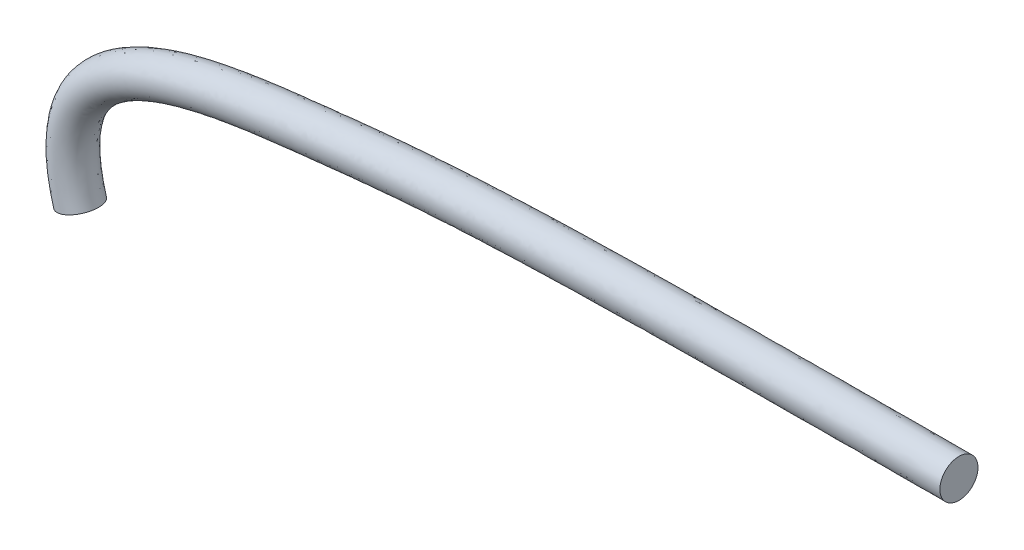
ISO-10303-21;
HEADER;
FILE_DESCRIPTION(('STEP AP214'),'2;1');
FILE_NAME('part.step','',(''),(''),'','','');
FILE_SCHEMA(('AUTOMOTIVE_DESIGN { 1 0 10303 214 1 1 1 1 }'));
ENDSEC;
DATA;
#1=APPLICATION_CONTEXT('core data for automotive mechanical design processes');
#2=APPLICATION_PROTOCOL_DEFINITION('international standard','automotive_design',2000,#1);
#3=PRODUCT_CONTEXT('',#1,'mechanical');
#4=PRODUCT('Part','Part','',(#3));
#5=PRODUCT_RELATED_PRODUCT_CATEGORY('part','',(#4));
#6=PRODUCT_DEFINITION_FORMATION('','',#4);
#7=PRODUCT_DEFINITION_CONTEXT('part definition',#1,'design');
#8=PRODUCT_DEFINITION('design','',#6,#7);
#9=PRODUCT_DEFINITION_SHAPE('','',#8);
#10=(LENGTH_UNIT() NAMED_UNIT(*) SI_UNIT(.MILLI.,.METRE.));
#11=(NAMED_UNIT(*) PLANE_ANGLE_UNIT() SI_UNIT($,.RADIAN.));
#12=(NAMED_UNIT(*) SI_UNIT($,.STERADIAN.) SOLID_ANGLE_UNIT());
#13=UNCERTAINTY_MEASURE_WITH_UNIT(LENGTH_MEASURE(1.E-05),#10,'distance_accuracy_value','');
#14=(GEOMETRIC_REPRESENTATION_CONTEXT(3) GLOBAL_UNCERTAINTY_ASSIGNED_CONTEXT((#13)) GLOBAL_UNIT_ASSIGNED_CONTEXT((#10,
#11,#12)) REPRESENTATION_CONTEXT('',''));
#15=CARTESIAN_POINT('',(0.,0.,0.));
#16=DIRECTION('',(0.,0.,1.));
#17=DIRECTION('',(1.,0.,0.));
#18=AXIS2_PLACEMENT_3D('',#15,#16,#17);
#19=CARTESIAN_POINT('',(0.,0.,0.));
#20=DIRECTION('',(-0.283229700503277,0.959052103252385,0.));
#21=DIRECTION('',(-0.959052103252385,-0.283229700503277,0.));
#22=AXIS2_PLACEMENT_3D('',#19,#20,#21);
#23=PLANE('',#22);
#24=CARTESIAN_POINT('',(0.,0.,0.));
#25=DIRECTION('',(-0.283229700503277,0.959052103252385,0.));
#26=DIRECTION('',(-0.959052103252385,-0.283229700503277,0.));
#27=AXIS2_PLACEMENT_3D('',#24,#25,#26);
#28=CIRCLE('',#27,15.85);
#29=CARTESIAN_POINT('',(-15.2009758365503,-4.48919075297695,0.));
#30=VERTEX_POINT('',#29);
#31=EDGE_CURVE('E47',#30,#30,#28,.T.);
#32=ORIENTED_EDGE('',*,*,#31,.F.);
#33=EDGE_LOOP('',(#32));
#34=FACE_BOUND('',#33,.T.);
#35=ADVANCED_FACE('F41',(#34),#23,.F.);
#36=CARTESIAN_POINT('',(730.653011233453,167.090760747647,0.));
#37=DIRECTION('',(0.999998749129555,0.00158168875705217,0.));
#38=DIRECTION('',(-0.00158168875705217,0.999998749129555,0.));
#39=AXIS2_PLACEMENT_3D('',#36,#37,#38);
#40=PLANE('',#39);
#41=CARTESIAN_POINT('',(730.653011233453,167.090760747647,0.));
#42=DIRECTION('',(0.999998749129555,0.00158168875705217,0.));
#43=DIRECTION('',(-0.00158168875705217,0.999998749129555,0.));
#44=AXIS2_PLACEMENT_3D('',#41,#42,#43);
#45=CIRCLE('',#44,15.85);
#46=CARTESIAN_POINT('',(730.627941466654,182.940740921351,0.));
#47=VERTEX_POINT('',#46);
#48=EDGE_CURVE('E11',#47,#47,#45,.T.);
#49=ORIENTED_EDGE('',*,*,#48,.T.);
#50=EDGE_LOOP('',(#49));
#51=FACE_BOUND('',#50,.T.);
#52=ADVANCED_FACE('F56',(#51),#40,.T.);
#53=CARTESIAN_POINT('',(-15.2009758365503,-4.48919075297695,0.));
#54=CARTESIAN_POINT('',(-20.067983459853,11.9911214793286,0.));
#55=CARTESIAN_POINT('',(-22.2699567836549,27.1825415549268,0.));
#56=CARTESIAN_POINT('',(-21.7328664920717,48.254459707937,0.));
#57=CARTESIAN_POINT('',(-20.9099188070549,54.9857195561,0.));
#58=CARTESIAN_POINT('',(-18.0252019880207,67.7980281035217,0.));
#59=CARTESIAN_POINT('',(-15.9623077166936,73.8763948148559,0.));
#60=CARTESIAN_POINT('',(-10.7290067489464,85.2811006853213,0.));
#61=CARTESIAN_POINT('',(-7.56055126473743,90.6049091734138,0.));
#62=CARTESIAN_POINT('',(-0.325321746111574,100.454282634767,0.));
#63=CARTESIAN_POINT('',(3.73904461283871,104.980320863935,0.));
#64=CARTESIAN_POINT('',(16.9664836239961,117.430747103944,0.));
#65=CARTESIAN_POINT('',(27.1408739571781,124.229904937638,0.));
#66=CARTESIAN_POINT('',(49.1051664881917,135.617165848305,0.));
#67=CARTESIAN_POINT('',(60.9131879135145,140.215150960872,0.));
#68=CARTESIAN_POINT('',(85.4489152798195,147.884771894646,0.));
#69=CARTESIAN_POINT('',(98.1816071743578,150.952955383676,0.));
#70=CARTESIAN_POINT('',(136.714004316894,158.615788360548,0.));
#71=CARTESIAN_POINT('',(162.878089059316,161.67798491246,0.));
#72=CARTESIAN_POINT('',(216.387469945877,167.766292146274,0.));
#73=CARTESIAN_POINT('',(242.825432921199,170.609402249726,0.));
#74=CARTESIAN_POINT('',(299.706508595926,175.302571685821,0.));
#75=CARTESIAN_POINT('',(330.119336400363,177.148840466215,0.));
#76=CARTESIAN_POINT('',(443.835549412277,181.441538296888,0.));
#77=CARTESIAN_POINT('',(549.650432625832,182.654490482459,0.));
#78=CARTESIAN_POINT('',(730.627941466654,182.940740921351,0.));
#79=CARTESIAN_POINT('',(-15.2009758365503,-4.48919075297695,31.7));
#80=CARTESIAN_POINT('',(-20.067983459853,11.9911214793286,31.7));
#81=CARTESIAN_POINT('',(-22.2699567836549,27.1825415549268,31.7));
#82=CARTESIAN_POINT('',(-21.7328664920717,48.2544597079371,31.7));
#83=CARTESIAN_POINT('',(-20.9099188070549,54.9857195561,31.7));
#84=CARTESIAN_POINT('',(-18.0252019880207,67.7980281035217,31.7));
#85=CARTESIAN_POINT('',(-15.9623077166936,73.8763948148559,31.7));
#86=CARTESIAN_POINT('',(-10.7290067489464,85.2811006853213,31.7));
#87=CARTESIAN_POINT('',(-7.56055126473743,90.6049091734138,31.7));
#88=CARTESIAN_POINT('',(-0.325321746111574,100.454282634767,31.7));
#89=CARTESIAN_POINT('',(3.73904461283871,104.980320863935,31.7));
#90=CARTESIAN_POINT('',(16.9664836239961,117.430747103944,31.7));
#91=CARTESIAN_POINT('',(27.1408739571781,124.229904937638,31.7));
#92=CARTESIAN_POINT('',(49.1051664881917,135.617165848305,31.7));
#93=CARTESIAN_POINT('',(60.9131879135145,140.215150960872,31.7));
#94=CARTESIAN_POINT('',(85.4489152798195,147.884771894646,31.7));
#95=CARTESIAN_POINT('',(98.1816071743578,150.952955383676,31.7));
#96=CARTESIAN_POINT('',(136.714004316894,158.615788360548,31.7));
#97=CARTESIAN_POINT('',(162.878089059316,161.67798491246,31.7));
#98=CARTESIAN_POINT('',(216.387469945877,167.766292146274,31.7));
#99=CARTESIAN_POINT('',(242.825432921199,170.609402249726,31.7));
#100=CARTESIAN_POINT('',(299.706508595926,175.302571685821,31.7));
#101=CARTESIAN_POINT('',(330.119336400363,177.148840466215,31.7));
#102=CARTESIAN_POINT('',(443.835549412277,181.441538296888,31.7));
#103=CARTESIAN_POINT('',(549.650432625832,182.654490482459,31.7));
#104=CARTESIAN_POINT('',(730.627941466654,182.940740921351,31.7));
#105=CARTESIAN_POINT('',(15.2009758365503,4.48919075297695,31.7));
#106=CARTESIAN_POINT('',(11.09864502982,18.3802091790098,31.7));
#107=CARTESIAN_POINT('',(9.51921750879497,30.2772327010443,31.7));
#108=CARTESIAN_POINT('',(9.90710820504908,45.495532374888,31.7));
#109=CARTESIAN_POINT('',(10.4920012255564,50.1372705408997,31.7));
#110=CARTESIAN_POINT('',(12.4245225482272,58.7204560025701,31.7));
#111=CARTESIAN_POINT('',(13.7710257137732,62.6645852858377,31.7));
#112=CARTESIAN_POINT('',(17.1606056634976,70.0513498900137,31.7));
#113=CARTESIAN_POINT('',(19.2056336605449,73.4965158811258,31.7));
#114=CARTESIAN_POINT('',(24.003986460538,80.028550366378,31.7));
#115=CARTESIAN_POINT('',(26.7597189401833,83.1149456048575,31.7));
#116=CARTESIAN_POINT('',(36.1062934478391,91.9124790052521,31.7));
#117=CARTESIAN_POINT('',(43.7995348021594,97.1595065824403,31.7));
#118=CARTESIAN_POINT('',(61.6273188266162,106.402218491185,31.7));
#119=CARTESIAN_POINT('',(71.7437422719553,110.388020786636,31.7));
#120=CARTESIAN_POINT('',(93.5339523322356,117.199420698693,31.7));
#121=CARTESIAN_POINT('',(105.202752994616,120.028470645874,31.7));
#122=CARTESIAN_POINT('',(141.22075680707,127.191273062409,31.7));
#123=CARTESIAN_POINT('',(166.551503747045,130.191413556064,31.7));
#124=CARTESIAN_POINT('',(219.856886335405,136.256509825924,31.7));
#125=CARTESIAN_POINT('',(245.918712553084,139.056905811267,31.7));
#126=CARTESIAN_POINT('',(301.826549628152,143.669774838159,31.7));
#127=CARTESIAN_POINT('',(331.702845380038,145.486038426934,31.7));
#128=CARTESIAN_POINT('',(444.255926730057,149.734828949303,31.7));
#129=CARTESIAN_POINT('',(549.823137923996,150.954723992775,31.7));
#130=CARTESIAN_POINT('',(730.678081000252,151.240780573944,31.7));
#131=CARTESIAN_POINT('',(15.2009758365503,4.48919075297695,0.));
#132=CARTESIAN_POINT('',(11.09864502982,18.3802091790098,0.));
#133=CARTESIAN_POINT('',(9.51921750879497,30.2772327010443,0.));
#134=CARTESIAN_POINT('',(9.90710820504908,45.495532374888,0.));
#135=CARTESIAN_POINT('',(10.4920012255564,50.1372705408901,0.));
#136=CARTESIAN_POINT('',(12.4245225482272,58.7204560025796,0.));
#137=CARTESIAN_POINT('',(13.7710257137777,62.6645852858377,0.));
#138=CARTESIAN_POINT('',(17.1606056634931,70.0513498900137,0.));
#139=CARTESIAN_POINT('',(19.2056336605405,73.4965158811082,0.));
#140=CARTESIAN_POINT('',(24.0039864605424,80.0285503663956,0.));
#141=CARTESIAN_POINT('',(26.7597189401833,83.1149456048396,0.));
#142=CARTESIAN_POINT('',(36.1062934478391,91.9124790052879,0.));
#143=CARTESIAN_POINT('',(43.7995348021594,97.1595065824403,0.));
#144=CARTESIAN_POINT('',(61.6273188266162,106.402218491185,0.));
#145=CARTESIAN_POINT('',(71.7437422719553,110.388020786636,0.));
#146=CARTESIAN_POINT('',(93.5339523322356,117.199420698693,0.));
#147=CARTESIAN_POINT('',(105.202752994616,120.02847064583,0.));
#148=CARTESIAN_POINT('',(141.22075680707,127.191273062496,0.));
#149=CARTESIAN_POINT('',(166.551503747045,130.191413556064,0.));
#150=CARTESIAN_POINT('',(219.856886335405,136.256509825924,0.));
#151=CARTESIAN_POINT('',(245.918712553084,139.056905811267,0.));
#152=CARTESIAN_POINT('',(301.826549628152,143.669774838159,0.));
#153=CARTESIAN_POINT('',(331.702845380038,145.486038426934,0.));
#154=CARTESIAN_POINT('',(444.255926730057,149.734828949303,0.));
#155=CARTESIAN_POINT('',(549.823137923996,150.954723987754,0.));
#156=CARTESIAN_POINT('',(730.678081000252,151.240780573944,0.));
#157=CARTESIAN_POINT('',(15.2009758365503,4.48919075297695,-31.7));
#158=CARTESIAN_POINT('',(11.09864502982,18.3802091790098,-31.7));
#159=CARTESIAN_POINT('',(9.51921750879498,30.2772327010443,-31.7));
#160=CARTESIAN_POINT('',(9.90710820504908,45.495532374888,-31.7));
#161=CARTESIAN_POINT('',(10.4920012255564,50.1372705408806,-31.7));
#162=CARTESIAN_POINT('',(12.4245225482272,58.7204560025891,-31.7));
#163=CARTESIAN_POINT('',(13.7710257137822,62.6645852858377,-31.7));
#164=CARTESIAN_POINT('',(17.1606056634887,70.0513498900137,-31.7));
#165=CARTESIAN_POINT('',(19.2056336605361,73.4965158810906,-31.7));
#166=CARTESIAN_POINT('',(24.0039864605468,80.0285503664133,-31.7));
#167=CARTESIAN_POINT('',(26.7597189401833,83.1149456048216,-31.7));
#168=CARTESIAN_POINT('',(36.1062934478391,91.9124790053238,-31.7));
#169=CARTESIAN_POINT('',(43.7995348021594,97.1595065824403,-31.7));
#170=CARTESIAN_POINT('',(61.6273188266162,106.402218491185,-31.7));
#171=CARTESIAN_POINT('',(71.7437422719553,110.388020786636,-31.7));
#172=CARTESIAN_POINT('',(93.5339523322356,117.199420698693,-31.7));
#173=CARTESIAN_POINT('',(105.202752994616,120.028470645786,-31.7));
#174=CARTESIAN_POINT('',(141.22075680707,127.191273062584,-31.7));
#175=CARTESIAN_POINT('',(166.551503747045,130.191413556064,-31.7));
#176=CARTESIAN_POINT('',(219.856886335405,136.256509825924,-31.7));
#177=CARTESIAN_POINT('',(245.918712553084,139.056905811267,-31.7));
#178=CARTESIAN_POINT('',(301.826549628152,143.669774838159,-31.7));
#179=CARTESIAN_POINT('',(331.702845380038,145.486038426934,-31.7));
#180=CARTESIAN_POINT('',(444.255926730057,149.734828949303,-31.7));
#181=CARTESIAN_POINT('',(549.823137923996,150.954723982732,-31.7));
#182=CARTESIAN_POINT('',(730.678081000252,151.240780573944,-31.7));
#183=CARTESIAN_POINT('',(-15.2009758365503,-4.48919075297695,-31.7));
#184=CARTESIAN_POINT('',(-20.067983459853,11.9911214793286,-31.7));
#185=CARTESIAN_POINT('',(-22.2699567836549,27.1825415549268,-31.7));
#186=CARTESIAN_POINT('',(-21.7328664920717,48.2544597079371,-31.7));
#187=CARTESIAN_POINT('',(-20.9099188070549,54.9857195561,-31.7));
#188=CARTESIAN_POINT('',(-18.0252019880207,67.7980281035217,-31.7));
#189=CARTESIAN_POINT('',(-15.9623077166936,73.8763948148559,-31.7));
#190=CARTESIAN_POINT('',(-10.7290067489464,85.2811006853213,-31.7));
#191=CARTESIAN_POINT('',(-7.56055126473743,90.6049091734138,-31.7));
#192=CARTESIAN_POINT('',(-0.325321746111574,100.454282634767,-31.7));
#193=CARTESIAN_POINT('',(3.73904461283871,104.980320863935,-31.7));
#194=CARTESIAN_POINT('',(16.9664836239961,117.430747103944,-31.7));
#195=CARTESIAN_POINT('',(27.1408739571781,124.229904937638,-31.7));
#196=CARTESIAN_POINT('',(49.1051664881917,135.617165848305,-31.7));
#197=CARTESIAN_POINT('',(60.9131879135145,140.215150960872,-31.7));
#198=CARTESIAN_POINT('',(85.4489152798195,147.884771894646,-31.7));
#199=CARTESIAN_POINT('',(98.1816071743578,150.952955383676,-31.7));
#200=CARTESIAN_POINT('',(136.714004316894,158.615788360548,-31.7));
#201=CARTESIAN_POINT('',(162.878089059316,161.67798491246,-31.7));
#202=CARTESIAN_POINT('',(216.387469945877,167.766292146274,-31.7));
#203=CARTESIAN_POINT('',(242.825432921199,170.609402249726,-31.7));
#204=CARTESIAN_POINT('',(299.706508595926,175.302571685821,-31.7));
#205=CARTESIAN_POINT('',(330.119336400363,177.148840466215,-31.7));
#206=CARTESIAN_POINT('',(443.835549412277,181.441538296888,-31.7));
#207=CARTESIAN_POINT('',(549.650432625832,182.654490482459,-31.7));
#208=CARTESIAN_POINT('',(730.627941466654,182.940740921351,-31.7));
#209=CARTESIAN_POINT('',(-15.2009758365503,-4.48919075297695,0.));
#210=CARTESIAN_POINT('',(-20.067983459853,11.9911214793286,0.));
#211=CARTESIAN_POINT('',(-22.2699567836549,27.1825415549268,0.));
#212=CARTESIAN_POINT('',(-21.7328664920717,48.254459707937,0.));
#213=CARTESIAN_POINT('',(-20.9099188070549,54.9857195561,0.));
#214=CARTESIAN_POINT('',(-18.0252019880207,67.7980281035217,0.));
#215=CARTESIAN_POINT('',(-15.9623077166936,73.8763948148559,0.));
#216=CARTESIAN_POINT('',(-10.7290067489464,85.2811006853213,0.));
#217=CARTESIAN_POINT('',(-7.56055126473743,90.6049091734138,0.));
#218=CARTESIAN_POINT('',(-0.325321746111574,100.454282634767,0.));
#219=CARTESIAN_POINT('',(3.73904461283871,104.980320863935,0.));
#220=CARTESIAN_POINT('',(16.9664836239961,117.430747103944,0.));
#221=CARTESIAN_POINT('',(27.1408739571781,124.229904937638,0.));
#222=CARTESIAN_POINT('',(49.1051664881917,135.617165848305,0.));
#223=CARTESIAN_POINT('',(60.9131879135145,140.215150960872,0.));
#224=CARTESIAN_POINT('',(85.4489152798195,147.884771894646,0.));
#225=CARTESIAN_POINT('',(98.1816071743578,150.952955383676,0.));
#226=CARTESIAN_POINT('',(136.714004316894,158.615788360548,0.));
#227=CARTESIAN_POINT('',(162.878089059316,161.67798491246,0.));
#228=CARTESIAN_POINT('',(216.387469945877,167.766292146274,0.));
#229=CARTESIAN_POINT('',(242.825432921199,170.609402249726,0.));
#230=CARTESIAN_POINT('',(299.706508595926,175.302571685821,0.));
#231=CARTESIAN_POINT('',(330.119336400363,177.148840466215,0.));
#232=CARTESIAN_POINT('',(443.835549412277,181.441538296888,0.));
#233=CARTESIAN_POINT('',(549.650432625832,182.654490482459,0.));
#234=CARTESIAN_POINT('',(730.627941466654,182.940740921351,0.));
#235=(BOUNDED_SURFACE() B_SPLINE_SURFACE(3,3,((#53,#54,#55,#56,#57,#58,#59,#60,#61,#62,#63,#64,
#65,#66,#67,#68,#69,#70,#71,#72,#73,#74,#75,#76,#77,#78),(#79,#80,#81,#82,#83,#84,#85,#86,#87,
#88,#89,#90,#91,#92,#93,#94,#95,#96,#97,#98,#99,#100,#101,#102,#103,#104),(#105,#106,#107,#108,
#109,#110,#111,#112,#113,#114,#115,#116,#117,#118,#119,#120,#121,#122,#123,#124,#125,#126,#127,
#128,#129,#130),(#131,#132,#133,#134,#135,#136,#137,#138,#139,#140,#141,#142,#143,#144,#145,
#146,#147,#148,#149,#150,#151,#152,#153,#154,#155,#156),(#157,#158,#159,#160,#161,#162,#163,
#164,#165,#166,#167,#168,#169,#170,#171,#172,#173,#174,#175,#176,#177,#178,#179,#180,#181,#182),
(#183,#184,#185,#186,#187,#188,#189,#190,#191,#192,#193,#194,#195,#196,#197,#198,#199,#200,#201,
#202,#203,#204,#205,#206,#207,#208),(#209,#210,#211,#212,#213,#214,#215,#216,#217,#218,#219,
#220,#221,#222,#223,#224,#225,#226,#227,#228,#229,#230,#231,#232,#233,#234)),.UNSPECIFIED.,.T.,
.F.,.F.) B_SPLINE_SURFACE_WITH_KNOTS((4,3,4),(4,2,2,2,2,2,2,2,2,2,2,2,4),(0.,0.5,1.),(0.,
0.0549670435866801,0.0824505653800201,0.10993408717336,0.1374176089667,0.16490113076004,
0.21986817434672,0.2748352179334,0.32980226152008,0.439736348693441,0.57980226152008,
0.71986817434672,1.),
.UNSPECIFIED.) GEOMETRIC_REPRESENTATION_ITEM() RATIONAL_B_SPLINE_SURFACE(((1.,1.,1.,1.,1.,1.,1.,
1.,1.,1.,1.,1.,1.,1.,1.,1.,1.,1.,1.,1.,1.,1.,1.,1.,1.,1.),(0.333333333333333,0.333333333333333,
0.333333333333333,0.333333333333333,0.333333333333333,0.333333333333333,0.333333333333333,
0.333333333333333,0.333333333333333,0.333333333333333,0.333333333333333,0.333333333333333,
0.333333333333333,0.333333333333333,0.333333333333333,0.333333333333333,0.333333333333333,
0.333333333333333,0.333333333333333,0.333333333333333,0.333333333333333,0.333333333333333,
0.333333333333333,0.333333333333333,0.333333333333333,0.333333333333333),(0.333333333333333,
0.333333333333333,0.333333333333333,0.333333333333333,0.333333333333333,0.333333333333333,
0.333333333333333,0.333333333333333,0.333333333333333,0.333333333333333,0.333333333333333,
0.333333333333333,0.333333333333333,0.333333333333333,0.333333333333333,0.333333333333333,
0.333333333333333,0.333333333333333,0.333333333333333,0.333333333333333,0.333333333333333,
0.333333333333333,0.333333333333333,0.333333333333333,0.333333333333333,0.333333333333333),(1.,
1.,1.,1.,1.,1.,1.,1.,1.,1.,1.,1.,1.,1.,1.,1.,1.,1.,1.,1.,1.,1.,1.,1.,1.,1.),(0.333333333333333,
0.333333333333333,0.333333333333333,0.333333333333333,0.333333333333333,0.333333333333333,
0.333333333333333,0.333333333333333,0.333333333333333,0.333333333333333,0.333333333333333,
0.333333333333333,0.333333333333333,0.333333333333333,0.333333333333333,0.333333333333333,
0.333333333333333,0.333333333333333,0.333333333333333,0.333333333333333,0.333333333333333,
0.333333333333333,0.333333333333333,0.333333333333333,0.333333333333333,0.333333333333333),
(0.333333333333333,0.333333333333333,0.333333333333333,0.333333333333333,0.333333333333333,
0.333333333333333,0.333333333333333,0.333333333333333,0.333333333333333,0.333333333333333,
0.333333333333333,0.333333333333333,0.333333333333333,0.333333333333333,0.333333333333333,
0.333333333333333,0.333333333333333,0.333333333333333,0.333333333333333,0.333333333333333,
0.333333333333333,0.333333333333333,0.333333333333333,0.333333333333333,0.333333333333333,
0.333333333333333),(1.,1.,1.,1.,1.,1.,1.,1.,1.,1.,1.,1.,1.,1.,1.,1.,1.,1.,1.,1.,1.,1.,1.,1.,1.,1.))) REPRESENTATION_ITEM('') SURFACE());
#236=ORIENTED_EDGE('',*,*,#48,.F.);
#237=EDGE_LOOP('',(#236));
#238=FACE_BOUND('',#237,.T.);
#239=ORIENTED_EDGE('',*,*,#31,.T.);
#240=EDGE_LOOP('',(#239));
#241=FACE_BOUND('',#240,.T.);
#242=ADVANCED_FACE('F53',(#238,#241),#235,.T.);
#243=CLOSED_SHELL('',(#35,#52,#242));
#244=MANIFOLD_SOLID_BREP('B2',#243);
#245=ADVANCED_BREP_SHAPE_REPRESENTATION('',(#18,#244),#14);
#246=SHAPE_DEFINITION_REPRESENTATION(#9,#245);
ENDSEC;
END-ISO-10303-21;
